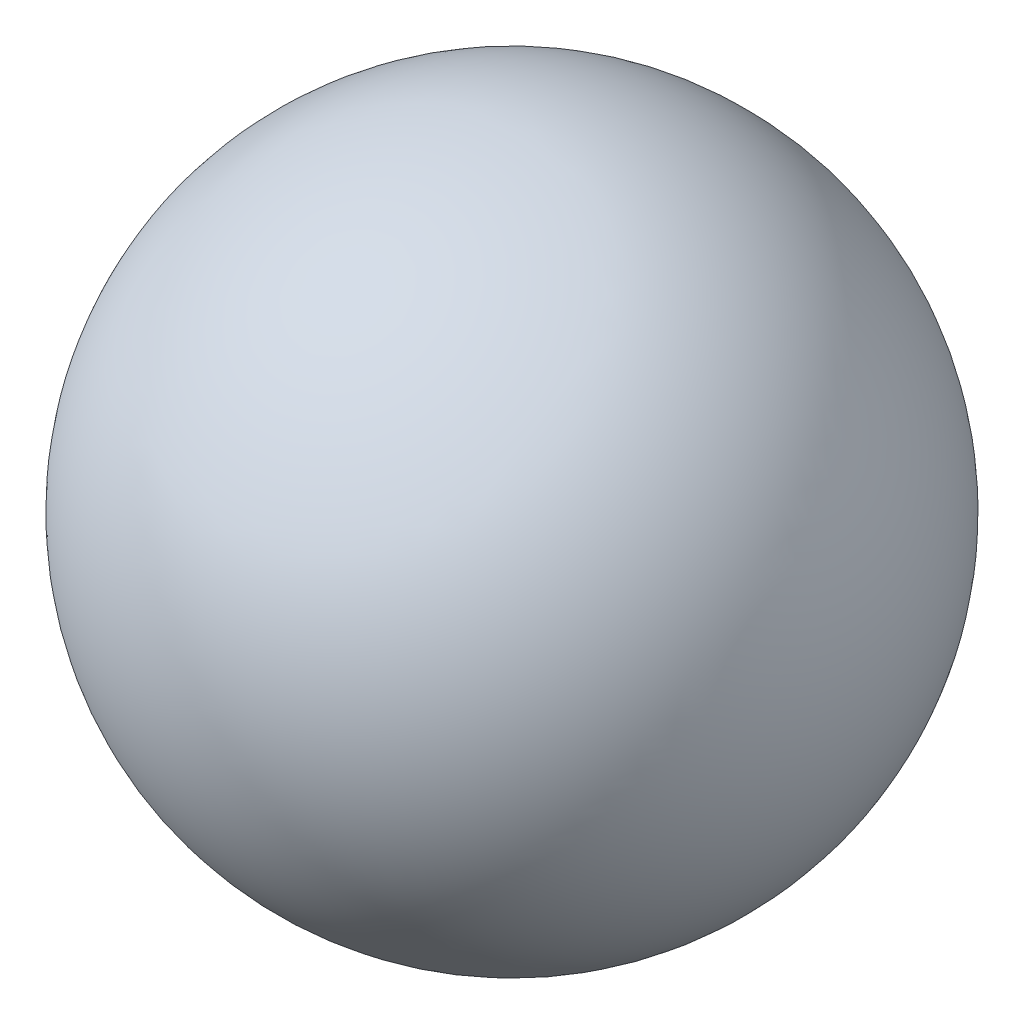
ISO-10303-21;
HEADER;
FILE_DESCRIPTION(('STEP AP214'),'2;1');
FILE_NAME('part.step','',(''),(''),'','','');
FILE_SCHEMA(('AUTOMOTIVE_DESIGN { 1 0 10303 214 1 1 1 1 }'));
ENDSEC;
DATA;
#1=APPLICATION_CONTEXT('core data for automotive mechanical design processes');
#2=APPLICATION_PROTOCOL_DEFINITION('international standard','automotive_design',2000,#1);
#3=PRODUCT_CONTEXT('',#1,'mechanical');
#4=PRODUCT('Part','Part','',(#3));
#5=PRODUCT_RELATED_PRODUCT_CATEGORY('part','',(#4));
#6=PRODUCT_DEFINITION_FORMATION('','',#4);
#7=PRODUCT_DEFINITION_CONTEXT('part definition',#1,'design');
#8=PRODUCT_DEFINITION('design','',#6,#7);
#9=PRODUCT_DEFINITION_SHAPE('','',#8);
#10=(LENGTH_UNIT() NAMED_UNIT(*) SI_UNIT(.MILLI.,.METRE.));
#11=(NAMED_UNIT(*) PLANE_ANGLE_UNIT() SI_UNIT($,.RADIAN.));
#12=(NAMED_UNIT(*) SI_UNIT($,.STERADIAN.) SOLID_ANGLE_UNIT());
#13=UNCERTAINTY_MEASURE_WITH_UNIT(LENGTH_MEASURE(1.E-05),#10,'distance_accuracy_value','');
#14=(GEOMETRIC_REPRESENTATION_CONTEXT(3) GLOBAL_UNCERTAINTY_ASSIGNED_CONTEXT((#13)) GLOBAL_UNIT_ASSIGNED_CONTEXT((#10,
#11,#12)) REPRESENTATION_CONTEXT('',''));
#15=CARTESIAN_POINT('',(0.,0.,0.));
#16=DIRECTION('',(0.,0.,1.));
#17=DIRECTION('',(1.,0.,0.));
#18=AXIS2_PLACEMENT_3D('',#15,#16,#17);
#19=CARTESIAN_POINT('',(0.,0.,0.));
#20=DIRECTION('',(-1.,0.,0.));
#21=DIRECTION('',(0.,1.,0.));
#22=AXIS2_PLACEMENT_3D('',#19,#20,#21);
#23=SPHERICAL_SURFACE('',#22,16.);
#24=CARTESIAN_POINT('',(-16.,0.,0.));
#25=VERTEX_POINT('',#24);
#26=VERTEX_LOOP('',#25);
#27=FACE_BOUND('',#26,.T.);
#28=ADVANCED_FACE('F39',(#27),#23,.T.);
#29=CLOSED_SHELL('',(#28));
#30=MANIFOLD_SOLID_BREP('B2',#29);
#31=ADVANCED_BREP_SHAPE_REPRESENTATION('',(#18,#30),#14);
#32=SHAPE_DEFINITION_REPRESENTATION(#9,#31);
ENDSEC;
END-ISO-10303-21;
